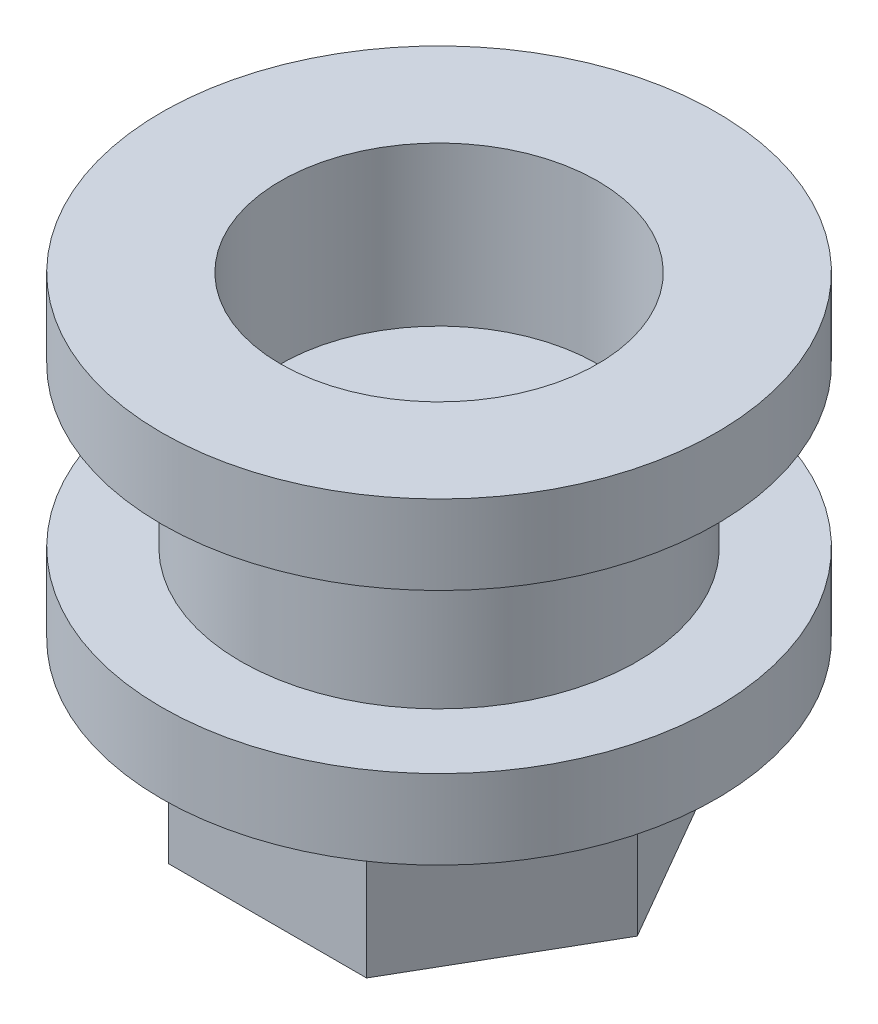
ISO-10303-21;
HEADER;
FILE_DESCRIPTION(('STEP AP214'),'2;1');
FILE_NAME('part.step','',(''),(''),'','','');
FILE_SCHEMA(('AUTOMOTIVE_DESIGN { 1 0 10303 214 1 1 1 1 }'));
ENDSEC;
DATA;
#1=APPLICATION_CONTEXT('core data for automotive mechanical design processes');
#2=APPLICATION_PROTOCOL_DEFINITION('international standard','automotive_design',2000,#1);
#3=PRODUCT_CONTEXT('',#1,'mechanical');
#4=PRODUCT('Part','Part','',(#3));
#5=PRODUCT_RELATED_PRODUCT_CATEGORY('part','',(#4));
#6=PRODUCT_DEFINITION_FORMATION('','',#4);
#7=PRODUCT_DEFINITION_CONTEXT('part definition',#1,'design');
#8=PRODUCT_DEFINITION('design','',#6,#7);
#9=PRODUCT_DEFINITION_SHAPE('','',#8);
#10=(LENGTH_UNIT() NAMED_UNIT(*) SI_UNIT(.MILLI.,.METRE.));
#11=(NAMED_UNIT(*) PLANE_ANGLE_UNIT() SI_UNIT($,.RADIAN.));
#12=(NAMED_UNIT(*) SI_UNIT($,.STERADIAN.) SOLID_ANGLE_UNIT());
#13=UNCERTAINTY_MEASURE_WITH_UNIT(LENGTH_MEASURE(1.E-05),#10,'distance_accuracy_value','');
#14=(GEOMETRIC_REPRESENTATION_CONTEXT(3) GLOBAL_UNCERTAINTY_ASSIGNED_CONTEXT((#13)) GLOBAL_UNIT_ASSIGNED_CONTEXT((#10,
#11,#12)) REPRESENTATION_CONTEXT('',''));
#15=CARTESIAN_POINT('',(0.,0.,0.));
#16=DIRECTION('',(0.,0.,1.));
#17=DIRECTION('',(1.,0.,0.));
#18=AXIS2_PLACEMENT_3D('',#15,#16,#17);
#19=CARTESIAN_POINT('',(3.75000000000001,4.,2.16506350946109));
#20=DIRECTION('',(-0.86602540378444,0.,-0.499999999999998));
#21=DIRECTION('',(-0.499999999999998,0.,0.86602540378444));
#22=AXIS2_PLACEMENT_3D('',#19,#20,#21);
#23=PLANE('',#22);
#24=DIRECTION('',(0.499999999999998,0.,-0.86602540378444));
#25=VECTOR('',#24,1.);
#26=CARTESIAN_POINT('',(3.75000000000001,0.,2.16506350946109));
#27=LINE('',#26,#25);
#28=CARTESIAN_POINT('',(2.50000000000001,0.,4.3301270189222));
#29=VERTEX_POINT('',#28);
#30=CARTESIAN_POINT('',(5.,0.,0.));
#31=VERTEX_POINT('',#30);
#32=EDGE_CURVE('E130',#29,#31,#27,.T.);
#33=ORIENTED_EDGE('',*,*,#32,.T.);
#34=DIRECTION('',(0.,-1.,0.));
#35=VECTOR('',#34,1.);
#36=CARTESIAN_POINT('',(5.,4.,0.));
#37=LINE('',#36,#35);
#38=CARTESIAN_POINT('',(5.,4.,0.));
#39=VERTEX_POINT('',#38);
#40=EDGE_CURVE('E41',#39,#31,#37,.T.);
#41=ORIENTED_EDGE('',*,*,#40,.F.);
#42=DIRECTION('',(0.499999999999998,0.,-0.86602540378444));
#43=VECTOR('',#42,1.);
#44=CARTESIAN_POINT('',(3.75000000000001,4.,2.16506350946109));
#45=LINE('',#44,#43);
#46=CARTESIAN_POINT('',(2.50000000000001,4.,4.3301270189222));
#47=VERTEX_POINT('',#46);
#48=EDGE_CURVE('E122',#47,#39,#45,.T.);
#49=ORIENTED_EDGE('',*,*,#48,.F.);
#50=DIRECTION('',(0.,-1.,0.));
#51=VECTOR('',#50,1.);
#52=CARTESIAN_POINT('',(2.50000000000001,4.,4.3301270189222));
#53=LINE('',#52,#51);
#54=EDGE_CURVE('E129',#47,#29,#53,.T.);
#55=ORIENTED_EDGE('',*,*,#54,.T.);
#56=EDGE_LOOP('',(#33,#41,#49,#55));
#57=FACE_BOUND('',#56,.T.);
#58=ADVANCED_FACE('F38',(#57),#23,.F.);
#59=CARTESIAN_POINT('',(3.75,4.,-2.1650635094611));
#60=DIRECTION('',(-0.866025403784439,0.,0.5));
#61=DIRECTION('',(0.5,0.,0.866025403784439));
#62=AXIS2_PLACEMENT_3D('',#59,#60,#61);
#63=PLANE('',#62);
#64=DIRECTION('',(-0.5,0.,-0.866025403784439));
#65=VECTOR('',#64,1.);
#66=CARTESIAN_POINT('',(3.75,0.,-2.1650635094611));
#67=LINE('',#66,#65);
#68=CARTESIAN_POINT('',(2.5,0.,-4.33012701892219));
#69=VERTEX_POINT('',#68);
#70=EDGE_CURVE('E133',#31,#69,#67,.T.);
#71=ORIENTED_EDGE('',*,*,#70,.T.);
#72=DIRECTION('',(0.,-1.,0.));
#73=VECTOR('',#72,1.);
#74=CARTESIAN_POINT('',(2.5,4.,-4.33012701892219));
#75=LINE('',#74,#73);
#76=CARTESIAN_POINT('',(2.5,4.,-4.33012701892219));
#77=VERTEX_POINT('',#76);
#78=EDGE_CURVE('E108',#77,#69,#75,.T.);
#79=ORIENTED_EDGE('',*,*,#78,.F.);
#80=DIRECTION('',(-0.5,0.,-0.866025403784439));
#81=VECTOR('',#80,1.);
#82=CARTESIAN_POINT('',(3.75,4.,-2.1650635094611));
#83=LINE('',#82,#81);
#84=EDGE_CURVE('E89',#39,#77,#83,.T.);
#85=ORIENTED_EDGE('',*,*,#84,.F.);
#86=ORIENTED_EDGE('',*,*,#40,.T.);
#87=EDGE_LOOP('',(#71,#79,#85,#86));
#88=FACE_BOUND('',#87,.T.);
#89=ADVANCED_FACE('F145',(#88),#63,.F.);
#90=CARTESIAN_POINT('',(0.,4.,-4.33012701892219));
#91=DIRECTION('',(0.,0.,1.));
#92=DIRECTION('',(1.,0.,0.));
#93=AXIS2_PLACEMENT_3D('',#90,#91,#92);
#94=PLANE('',#93);
#95=DIRECTION('',(-1.,0.,0.));
#96=VECTOR('',#95,1.);
#97=CARTESIAN_POINT('',(0.,0.,-4.33012701892219));
#98=LINE('',#97,#96);
#99=CARTESIAN_POINT('',(-2.5,0.,-4.33012701892219));
#100=VERTEX_POINT('',#99);
#101=EDGE_CURVE('E104',#69,#100,#98,.T.);
#102=ORIENTED_EDGE('',*,*,#101,.T.);
#103=DIRECTION('',(0.,-1.,0.));
#104=VECTOR('',#103,1.);
#105=CARTESIAN_POINT('',(-2.5,4.,-4.33012701892219));
#106=LINE('',#105,#104);
#107=CARTESIAN_POINT('',(-2.5,4.,-4.33012701892219));
#108=VERTEX_POINT('',#107);
#109=EDGE_CURVE('E97',#108,#100,#106,.T.);
#110=ORIENTED_EDGE('',*,*,#109,.F.);
#111=DIRECTION('',(-1.,0.,0.));
#112=VECTOR('',#111,1.);
#113=CARTESIAN_POINT('',(0.,4.,-4.33012701892219));
#114=LINE('',#113,#112);
#115=EDGE_CURVE('E102',#77,#108,#114,.T.);
#116=ORIENTED_EDGE('',*,*,#115,.F.);
#117=ORIENTED_EDGE('',*,*,#78,.T.);
#118=EDGE_LOOP('',(#102,#110,#116,#117));
#119=FACE_BOUND('',#118,.T.);
#120=ADVANCED_FACE('F99',(#119),#94,.F.);
#121=CARTESIAN_POINT('',(-3.75,4.,-2.1650635094611));
#122=DIRECTION('',(0.866025403784439,0.,0.5));
#123=DIRECTION('',(0.5,0.,-0.866025403784439));
#124=AXIS2_PLACEMENT_3D('',#121,#122,#123);
#125=PLANE('',#124);
#126=DIRECTION('',(-0.5,0.,0.866025403784439));
#127=VECTOR('',#126,1.);
#128=CARTESIAN_POINT('',(-3.75,0.,-2.1650635094611));
#129=LINE('',#128,#127);
#130=CARTESIAN_POINT('',(-5.,0.,0.));
#131=VERTEX_POINT('',#130);
#132=EDGE_CURVE('E137',#100,#131,#129,.T.);
#133=ORIENTED_EDGE('',*,*,#132,.T.);
#134=DIRECTION('',(0.,-1.,0.));
#135=VECTOR('',#134,1.);
#136=CARTESIAN_POINT('',(-5.,4.,0.));
#137=LINE('',#136,#135);
#138=CARTESIAN_POINT('',(-5.,4.,0.));
#139=VERTEX_POINT('',#138);
#140=EDGE_CURVE('E109',#139,#131,#137,.T.);
#141=ORIENTED_EDGE('',*,*,#140,.F.);
#142=DIRECTION('',(-0.5,0.,0.866025403784439));
#143=VECTOR('',#142,1.);
#144=CARTESIAN_POINT('',(-3.75,4.,-2.1650635094611));
#145=LINE('',#144,#143);
#146=EDGE_CURVE('E112',#108,#139,#145,.T.);
#147=ORIENTED_EDGE('',*,*,#146,.F.);
#148=ORIENTED_EDGE('',*,*,#109,.T.);
#149=EDGE_LOOP('',(#133,#141,#147,#148));
#150=FACE_BOUND('',#149,.T.);
#151=ADVANCED_FACE('F113',(#150),#125,.F.);
#152=CARTESIAN_POINT('',(-3.75,4.,2.1650635094611));
#153=DIRECTION('',(-0.866025403784438,0.,0.500000000000001));
#154=DIRECTION('',(0.500000000000001,0.,0.866025403784438));
#155=AXIS2_PLACEMENT_3D('',#152,#153,#154);
#156=PLANE('',#155);
#157=DIRECTION('',(-0.500000000000001,0.,-0.866025403784438));
#158=VECTOR('',#157,1.);
#159=CARTESIAN_POINT('',(-3.75,0.,2.1650635094611));
#160=LINE('',#159,#158);
#161=CARTESIAN_POINT('',(-2.49999999999999,0.,4.3301270189222));
#162=VERTEX_POINT('',#161);
#163=EDGE_CURVE('E139',#162,#131,#160,.T.);
#164=ORIENTED_EDGE('',*,*,#163,.F.);
#165=DIRECTION('',(0.,-1.,0.));
#166=VECTOR('',#165,1.);
#167=CARTESIAN_POINT('',(-2.49999999999999,4.,4.3301270189222));
#168=LINE('',#167,#166);
#169=CARTESIAN_POINT('',(-2.49999999999999,4.,4.3301270189222));
#170=VERTEX_POINT('',#169);
#171=EDGE_CURVE('E55',#170,#162,#168,.T.);
#172=ORIENTED_EDGE('',*,*,#171,.F.);
#173=DIRECTION('',(-0.500000000000001,0.,-0.866025403784438));
#174=VECTOR('',#173,1.);
#175=CARTESIAN_POINT('',(-3.75,4.,2.1650635094611));
#176=LINE('',#175,#174);
#177=EDGE_CURVE('E116',#170,#139,#176,.T.);
#178=ORIENTED_EDGE('',*,*,#177,.T.);
#179=ORIENTED_EDGE('',*,*,#140,.T.);
#180=EDGE_LOOP('',(#164,#172,#178,#179));
#181=FACE_BOUND('',#180,.T.);
#182=ADVANCED_FACE('F151',(#181),#156,.T.);
#183=CARTESIAN_POINT('',(0.,4.,4.3301270189222));
#184=DIRECTION('',(0.,0.,-1.));
#185=DIRECTION('',(-1.,0.,0.));
#186=AXIS2_PLACEMENT_3D('',#183,#184,#185);
#187=PLANE('',#186);
#188=DIRECTION('',(1.,0.,0.));
#189=VECTOR('',#188,1.);
#190=CARTESIAN_POINT('',(0.,0.,4.3301270189222));
#191=LINE('',#190,#189);
#192=EDGE_CURVE('E80',#162,#29,#191,.T.);
#193=ORIENTED_EDGE('',*,*,#192,.T.);
#194=ORIENTED_EDGE('',*,*,#54,.F.);
#195=DIRECTION('',(1.,0.,0.));
#196=VECTOR('',#195,1.);
#197=CARTESIAN_POINT('',(0.,4.,4.3301270189222));
#198=LINE('',#197,#196);
#199=EDGE_CURVE('E127',#170,#47,#198,.T.);
#200=ORIENTED_EDGE('',*,*,#199,.F.);
#201=ORIENTED_EDGE('',*,*,#171,.T.);
#202=EDGE_LOOP('',(#193,#194,#200,#201));
#203=FACE_BOUND('',#202,.T.);
#204=ADVANCED_FACE('F152',(#203),#187,.F.);
#205=CARTESIAN_POINT('',(0.,0.,0.));
#206=DIRECTION('',(0.,1.,0.));
#207=DIRECTION('',(0.,0.,1.));
#208=AXIS2_PLACEMENT_3D('',#205,#206,#207);
#209=PLANE('',#208);
#210=CARTESIAN_POINT('',(0.,0.,0.));
#211=DIRECTION('',(0.,-1.,0.));
#212=DIRECTION('',(0.,0.,-1.));
#213=AXIS2_PLACEMENT_3D('',#210,#211,#212);
#214=CIRCLE('',#213,1.5);
#215=CARTESIAN_POINT('',(0.,0.,-1.5));
#216=VERTEX_POINT('',#215);
#217=EDGE_CURVE('E134',#216,#216,#214,.T.);
#218=ORIENTED_EDGE('',*,*,#217,.F.);
#219=EDGE_LOOP('',(#218));
#220=FACE_BOUND('',#219,.T.);
#221=ORIENTED_EDGE('',*,*,#32,.F.);
#222=ORIENTED_EDGE('',*,*,#192,.F.);
#223=ORIENTED_EDGE('',*,*,#163,.T.);
#224=ORIENTED_EDGE('',*,*,#132,.F.);
#225=ORIENTED_EDGE('',*,*,#101,.F.);
#226=ORIENTED_EDGE('',*,*,#70,.F.);
#227=EDGE_LOOP('',(#221,#222,#223,#224,#225,#226));
#228=FACE_BOUND('',#227,.T.);
#229=ADVANCED_FACE('F150',(#220,#228),#209,.F.);
#230=CARTESIAN_POINT('',(0.,15.,0.));
#231=DIRECTION('',(0.,-1.,0.));
#232=DIRECTION('',(0.,0.,-1.));
#233=AXIS2_PLACEMENT_3D('',#230,#231,#232);
#234=CYLINDRICAL_SURFACE('',#233,1.5);
#235=CARTESIAN_POINT('',(0.,4.,0.));
#236=DIRECTION('',(0.,1.,0.));
#237=DIRECTION('',(0.,0.,1.));
#238=AXIS2_PLACEMENT_3D('',#235,#236,#237);
#239=CIRCLE('',#238,1.5);
#240=CARTESIAN_POINT('',(0.,4.,1.5));
#241=VERTEX_POINT('',#240);
#242=EDGE_CURVE('E298',#241,#241,#239,.T.);
#243=ORIENTED_EDGE('',*,*,#242,.T.);
#244=EDGE_LOOP('',(#243));
#245=FACE_BOUND('',#244,.T.);
#246=ORIENTED_EDGE('',*,*,#217,.T.);
#247=EDGE_LOOP('',(#246));
#248=FACE_BOUND('',#247,.T.);
#249=ADVANCED_FACE('F159',(#245,#248),#234,.F.);
#250=CARTESIAN_POINT('',(0.,6.,0.));
#251=DIRECTION('',(0.,1.,0.));
#252=DIRECTION('',(0.,0.,1.));
#253=AXIS2_PLACEMENT_3D('',#250,#251,#252);
#254=PLANE('',#253);
#255=CARTESIAN_POINT('',(0.,6.,0.));
#256=DIRECTION('',(0.,1.,0.));
#257=DIRECTION('',(0.,0.,1.));
#258=AXIS2_PLACEMENT_3D('',#255,#256,#257);
#259=CIRCLE('',#258,5.);
#260=CARTESIAN_POINT('',(0.,6.,5.));
#261=VERTEX_POINT('',#260);
#262=EDGE_CURVE('E11',#261,#261,#259,.T.);
#263=ORIENTED_EDGE('',*,*,#262,.F.);
#264=EDGE_LOOP('',(#263));
#265=FACE_BOUND('',#264,.T.);
#266=CARTESIAN_POINT('',(0.,6.,0.));
#267=DIRECTION('',(0.,1.,0.));
#268=DIRECTION('',(0.,0.,1.));
#269=AXIS2_PLACEMENT_3D('',#266,#267,#268);
#270=CIRCLE('',#269,7.);
#271=CARTESIAN_POINT('',(0.,6.,7.));
#272=VERTEX_POINT('',#271);
#273=EDGE_CURVE('E302',#272,#272,#270,.T.);
#274=ORIENTED_EDGE('',*,*,#273,.T.);
#275=EDGE_LOOP('',(#274));
#276=FACE_BOUND('',#275,.T.);
#277=ADVANCED_FACE('F196',(#265,#276),#254,.T.);
#278=CARTESIAN_POINT('',(0.,6.,0.));
#279=DIRECTION('',(0.,-1.,0.));
#280=DIRECTION('',(0.,0.,-1.));
#281=AXIS2_PLACEMENT_3D('',#278,#279,#280);
#282=CYLINDRICAL_SURFACE('',#281,7.);
#283=ORIENTED_EDGE('',*,*,#273,.F.);
#284=EDGE_LOOP('',(#283));
#285=FACE_BOUND('',#284,.T.);
#286=CARTESIAN_POINT('',(0.,4.,0.));
#287=DIRECTION('',(0.,1.,0.));
#288=DIRECTION('',(0.,0.,1.));
#289=AXIS2_PLACEMENT_3D('',#286,#287,#288);
#290=CIRCLE('',#289,7.);
#291=CARTESIAN_POINT('',(0.,4.,7.));
#292=VERTEX_POINT('',#291);
#293=EDGE_CURVE('E305',#292,#292,#290,.T.);
#294=ORIENTED_EDGE('',*,*,#293,.T.);
#295=EDGE_LOOP('',(#294));
#296=FACE_BOUND('',#295,.T.);
#297=ADVANCED_FACE('F191',(#285,#296),#282,.T.);
#298=CARTESIAN_POINT('',(0.,4.,0.));
#299=DIRECTION('',(0.,1.,0.));
#300=DIRECTION('',(0.,0.,1.));
#301=AXIS2_PLACEMENT_3D('',#298,#299,#300);
#302=PLANE('',#301);
#303=ORIENTED_EDGE('',*,*,#293,.F.);
#304=EDGE_LOOP('',(#303));
#305=FACE_BOUND('',#304,.T.);
#306=ORIENTED_EDGE('',*,*,#199,.T.);
#307=ORIENTED_EDGE('',*,*,#48,.T.);
#308=ORIENTED_EDGE('',*,*,#84,.T.);
#309=ORIENTED_EDGE('',*,*,#115,.T.);
#310=ORIENTED_EDGE('',*,*,#146,.T.);
#311=ORIENTED_EDGE('',*,*,#177,.F.);
#312=EDGE_LOOP('',(#306,#307,#308,#309,#310,#311));
#313=FACE_BOUND('',#312,.T.);
#314=ADVANCED_FACE('F119',(#305,#313),#302,.F.);
#315=ORIENTED_EDGE('',*,*,#242,.F.);
#316=EDGE_LOOP('',(#315));
#317=FACE_BOUND('',#316,.T.);
#318=ADVANCED_FACE('F208',(#317),#302,.F.);
#319=CARTESIAN_POINT('',(0.,10.,0.));
#320=DIRECTION('',(0.,-1.,0.));
#321=DIRECTION('',(0.,0.,-1.));
#322=AXIS2_PLACEMENT_3D('',#319,#320,#321);
#323=CYLINDRICAL_SURFACE('',#322,5.);
#324=CARTESIAN_POINT('',(0.,10.,0.));
#325=DIRECTION('',(0.,1.,0.));
#326=DIRECTION('',(0.,0.,1.));
#327=AXIS2_PLACEMENT_3D('',#324,#325,#326);
#328=CIRCLE('',#327,5.);
#329=CARTESIAN_POINT('',(0.,10.,5.));
#330=VERTEX_POINT('',#329);
#331=EDGE_CURVE('E308',#330,#330,#328,.T.);
#332=ORIENTED_EDGE('',*,*,#331,.F.);
#333=EDGE_LOOP('',(#332));
#334=FACE_BOUND('',#333,.T.);
#335=ORIENTED_EDGE('',*,*,#262,.T.);
#336=EDGE_LOOP('',(#335));
#337=FACE_BOUND('',#336,.T.);
#338=ADVANCED_FACE('F218',(#334,#337),#323,.T.);
#339=CARTESIAN_POINT('',(0.,12.,0.));
#340=DIRECTION('',(0.,-1.,0.));
#341=DIRECTION('',(0.,0.,-1.));
#342=AXIS2_PLACEMENT_3D('',#339,#340,#341);
#343=CYLINDRICAL_SURFACE('',#342,7.);
#344=CARTESIAN_POINT('',(0.,12.,0.));
#345=DIRECTION('',(0.,1.,0.));
#346=DIRECTION('',(0.,0.,1.));
#347=AXIS2_PLACEMENT_3D('',#344,#345,#346);
#348=CIRCLE('',#347,7.);
#349=CARTESIAN_POINT('',(0.,12.,7.));
#350=VERTEX_POINT('',#349);
#351=EDGE_CURVE('E313',#350,#350,#348,.T.);
#352=ORIENTED_EDGE('',*,*,#351,.F.);
#353=EDGE_LOOP('',(#352));
#354=FACE_BOUND('',#353,.T.);
#355=CARTESIAN_POINT('',(0.,10.,0.));
#356=DIRECTION('',(0.,1.,0.));
#357=DIRECTION('',(0.,0.,1.));
#358=AXIS2_PLACEMENT_3D('',#355,#356,#357);
#359=CIRCLE('',#358,7.);
#360=CARTESIAN_POINT('',(0.,10.,7.));
#361=VERTEX_POINT('',#360);
#362=EDGE_CURVE('E314',#361,#361,#359,.T.);
#363=ORIENTED_EDGE('',*,*,#362,.T.);
#364=EDGE_LOOP('',(#363));
#365=FACE_BOUND('',#364,.T.);
#366=ADVANCED_FACE('F236',(#354,#365),#343,.T.);
#367=CARTESIAN_POINT('',(0.,12.,0.));
#368=DIRECTION('',(0.,1.,0.));
#369=DIRECTION('',(0.,0.,1.));
#370=AXIS2_PLACEMENT_3D('',#367,#368,#369);
#371=PLANE('',#370);
#372=CARTESIAN_POINT('',(0.,12.,0.));
#373=DIRECTION('',(0.,1.,0.));
#374=DIRECTION('',(0.,0.,1.));
#375=AXIS2_PLACEMENT_3D('',#372,#373,#374);
#376=CIRCLE('',#375,4.);
#377=CARTESIAN_POINT('',(0.,12.,4.));
#378=VERTEX_POINT('',#377);
#379=EDGE_CURVE('E320',#378,#378,#376,.T.);
#380=ORIENTED_EDGE('',*,*,#379,.F.);
#381=EDGE_LOOP('',(#380));
#382=FACE_BOUND('',#381,.T.);
#383=ORIENTED_EDGE('',*,*,#351,.T.);
#384=EDGE_LOOP('',(#383));
#385=FACE_BOUND('',#384,.T.);
#386=ADVANCED_FACE('F246',(#382,#385),#371,.T.);
#387=CARTESIAN_POINT('',(0.,10.,0.));
#388=DIRECTION('',(0.,1.,0.));
#389=DIRECTION('',(0.,0.,1.));
#390=AXIS2_PLACEMENT_3D('',#387,#388,#389);
#391=PLANE('',#390);
#392=ORIENTED_EDGE('',*,*,#331,.T.);
#393=EDGE_LOOP('',(#392));
#394=FACE_BOUND('',#393,.T.);
#395=ORIENTED_EDGE('',*,*,#362,.F.);
#396=EDGE_LOOP('',(#395));
#397=FACE_BOUND('',#396,.T.);
#398=ADVANCED_FACE('F254',(#394,#397),#391,.F.);
#399=CARTESIAN_POINT('',(0.,8.,0.));
#400=DIRECTION('',(0.,1.,0.));
#401=DIRECTION('',(0.,0.,1.));
#402=AXIS2_PLACEMENT_3D('',#399,#400,#401);
#403=CYLINDRICAL_SURFACE('',#402,4.);
#404=CARTESIAN_POINT('',(0.,8.,0.));
#405=DIRECTION('',(0.,1.,0.));
#406=DIRECTION('',(0.,0.,1.));
#407=AXIS2_PLACEMENT_3D('',#404,#405,#406);
#408=CIRCLE('',#407,4.);
#409=CARTESIAN_POINT('',(0.,8.,4.));
#410=VERTEX_POINT('',#409);
#411=EDGE_CURVE('E317',#410,#410,#408,.T.);
#412=ORIENTED_EDGE('',*,*,#411,.F.);
#413=EDGE_LOOP('',(#412));
#414=FACE_BOUND('',#413,.T.);
#415=ORIENTED_EDGE('',*,*,#379,.T.);
#416=EDGE_LOOP('',(#415));
#417=FACE_BOUND('',#416,.T.);
#418=ADVANCED_FACE('F259',(#414,#417),#403,.F.);
#419=CARTESIAN_POINT('',(0.,8.,0.));
#420=DIRECTION('',(0.,1.,0.));
#421=DIRECTION('',(0.,0.,1.));
#422=AXIS2_PLACEMENT_3D('',#419,#420,#421);
#423=PLANE('',#422);
#424=ORIENTED_EDGE('',*,*,#411,.T.);
#425=EDGE_LOOP('',(#424));
#426=FACE_BOUND('',#425,.T.);
#427=ADVANCED_FACE('F276',(#426),#423,.T.);
#428=CLOSED_SHELL('',(#58,#89,#120,#151,#182,#204,#229,#249,#277,#297,#314,#318,#338,#366,#386,
#398,#418,#427));
#429=MANIFOLD_SOLID_BREP('B2',#428);
#430=ADVANCED_BREP_SHAPE_REPRESENTATION('',(#18,#429),#14);
#431=SHAPE_DEFINITION_REPRESENTATION(#9,#430);
ENDSEC;
END-ISO-10303-21;
